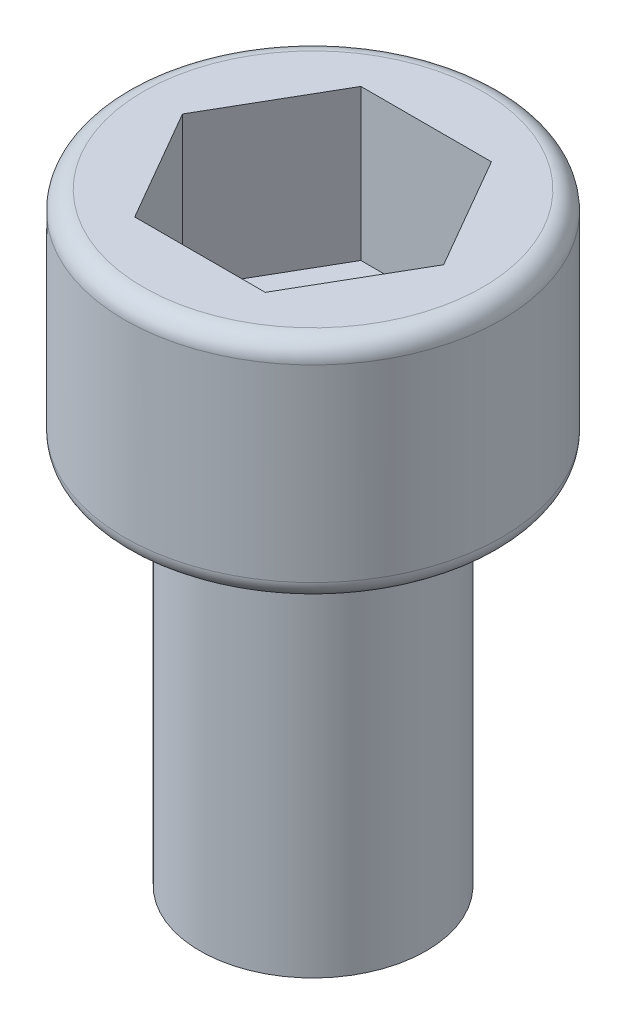
ISO-10303-21;
HEADER;
FILE_DESCRIPTION(('STEP AP214'),'2;1');
FILE_NAME('part.step','',(''),(''),'','','');
FILE_SCHEMA(('AUTOMOTIVE_DESIGN { 1 0 10303 214 1 1 1 1 }'));
ENDSEC;
DATA;
#1=APPLICATION_CONTEXT('core data for automotive mechanical design processes');
#2=APPLICATION_PROTOCOL_DEFINITION('international standard','automotive_design',2000,#1);
#3=PRODUCT_CONTEXT('',#1,'mechanical');
#4=PRODUCT('Part','Part','',(#3));
#5=PRODUCT_RELATED_PRODUCT_CATEGORY('part','',(#4));
#6=PRODUCT_DEFINITION_FORMATION('','',#4);
#7=PRODUCT_DEFINITION_CONTEXT('part definition',#1,'design');
#8=PRODUCT_DEFINITION('design','',#6,#7);
#9=PRODUCT_DEFINITION_SHAPE('','',#8);
#10=(LENGTH_UNIT() NAMED_UNIT(*) SI_UNIT(.MILLI.,.METRE.));
#11=(NAMED_UNIT(*) PLANE_ANGLE_UNIT() SI_UNIT($,.RADIAN.));
#12=(NAMED_UNIT(*) SI_UNIT($,.STERADIAN.) SOLID_ANGLE_UNIT());
#13=UNCERTAINTY_MEASURE_WITH_UNIT(LENGTH_MEASURE(1.E-05),#10,'distance_accuracy_value','');
#14=(GEOMETRIC_REPRESENTATION_CONTEXT(3) GLOBAL_UNCERTAINTY_ASSIGNED_CONTEXT((#13)) GLOBAL_UNIT_ASSIGNED_CONTEXT((#10,
#11,#12)) REPRESENTATION_CONTEXT('',''));
#15=CARTESIAN_POINT('',(0.,0.,0.));
#16=DIRECTION('',(0.,0.,1.));
#17=DIRECTION('',(1.,0.,0.));
#18=AXIS2_PLACEMENT_3D('',#15,#16,#17);
#19=CARTESIAN_POINT('',(0.,-4.,0.));
#20=DIRECTION('',(0.,-1.,0.));
#21=DIRECTION('',(1.,0.,0.));
#22=AXIS2_PLACEMENT_3D('',#19,#20,#21);
#23=PLANE('',#22);
#24=CARTESIAN_POINT('',(0.,-4.,0.));
#25=DIRECTION('',(0.,-1.,0.));
#26=DIRECTION('',(1.,0.,0.));
#27=AXIS2_PLACEMENT_3D('',#24,#25,#26);
#28=CIRCLE('',#27,1.49999999999999);
#29=CARTESIAN_POINT('',(1.5,-4.,0.));
#30=VERTEX_POINT('',#29);
#31=EDGE_CURVE('E171',#30,#30,#28,.T.);
#32=ORIENTED_EDGE('',*,*,#31,.T.);
#33=EDGE_LOOP('',(#32));
#34=FACE_BOUND('',#33,.T.);
#35=ADVANCED_FACE('F43',(#34),#23,.T.);
#36=CARTESIAN_POINT('',(3.42844774755202E-12,-1000.,0.));
#37=DIRECTION('',(0.,-1.,0.));
#38=DIRECTION('',(1.,0.,0.));
#39=AXIS2_PLACEMENT_3D('',#36,#37,#38);
#40=CYLINDRICAL_SURFACE('',#39,1.5);
#41=CARTESIAN_POINT('',(0.,0.99999999999989,0.));
#42=DIRECTION('',(0.,-1.,0.));
#43=DIRECTION('',(1.,0.,0.));
#44=AXIS2_PLACEMENT_3D('',#41,#42,#43);
#45=CIRCLE('',#44,1.50000000000001);
#46=CARTESIAN_POINT('',(1.5,0.999999999999895,0.));
#47=VERTEX_POINT('',#46);
#48=EDGE_CURVE('E158',#47,#47,#45,.T.);
#49=ORIENTED_EDGE('',*,*,#48,.T.);
#50=EDGE_LOOP('',(#49));
#51=FACE_BOUND('',#50,.T.);
#52=ORIENTED_EDGE('',*,*,#31,.F.);
#53=EDGE_LOOP('',(#52));
#54=FACE_BOUND('',#53,.T.);
#55=ADVANCED_FACE('F197',(#51,#54),#40,.T.);
#56=CARTESIAN_POINT('',(1.5,0.999999999999998,0.));
#57=DIRECTION('',(0.,-1.,0.));
#58=DIRECTION('',(1.,0.,0.));
#59=AXIS2_PLACEMENT_3D('',#56,#57,#58);
#60=PLANE('',#59);
#61=CARTESIAN_POINT('',(0.,0.999999999999993,0.));
#62=DIRECTION('',(0.,-1.,0.));
#63=DIRECTION('',(1.,0.,0.));
#64=AXIS2_PLACEMENT_3D('',#61,#62,#63);
#65=CIRCLE('',#64,2.25000000000001);
#66=CARTESIAN_POINT('',(2.25000000000001,1.,0.));
#67=VERTEX_POINT('',#66);
#68=EDGE_CURVE('E175',#67,#67,#65,.T.);
#69=ORIENTED_EDGE('',*,*,#68,.T.);
#70=EDGE_LOOP('',(#69));
#71=FACE_BOUND('',#70,.T.);
#72=ORIENTED_EDGE('',*,*,#48,.F.);
#73=EDGE_LOOP('',(#72));
#74=FACE_BOUND('',#73,.T.);
#75=ADVANCED_FACE('F194',(#71,#74),#60,.T.);
#76=CARTESIAN_POINT('',(3.42844774755202E-12,-1000.,0.));
#77=DIRECTION('',(0.,-1.,0.));
#78=DIRECTION('',(1.,0.,0.));
#79=AXIS2_PLACEMENT_3D('',#76,#77,#78);
#80=CYLINDRICAL_SURFACE('',#79,2.50000000000001);
#81=CARTESIAN_POINT('',(0.,1.24999999999997,0.));
#82=DIRECTION('',(0.,-1.,0.));
#83=DIRECTION('',(1.,0.,0.));
#84=AXIS2_PLACEMENT_3D('',#81,#82,#83);
#85=CIRCLE('',#84,2.50000000000001);
#86=CARTESIAN_POINT('',(2.5,1.24999999999998,0.));
#87=VERTEX_POINT('',#86);
#88=EDGE_CURVE('E52',#87,#87,#85,.F.);
#89=ORIENTED_EDGE('',*,*,#88,.T.);
#90=EDGE_LOOP('',(#89));
#91=FACE_BOUND('',#90,.T.);
#92=CARTESIAN_POINT('',(0.,3.74999999999992,0.));
#93=DIRECTION('',(0.,1.,0.));
#94=DIRECTION('',(-1.,0.,0.));
#95=AXIS2_PLACEMENT_3D('',#92,#93,#94);
#96=CIRCLE('',#95,2.50000000000001);
#97=CARTESIAN_POINT('',(-2.50000000000003,3.74999999999991,0.));
#98=VERTEX_POINT('',#97);
#99=EDGE_CURVE('E179',#98,#98,#96,.F.);
#100=ORIENTED_EDGE('',*,*,#99,.T.);
#101=EDGE_LOOP('',(#100));
#102=FACE_BOUND('',#101,.T.);
#103=ADVANCED_FACE('F186',(#91,#102),#80,.T.);
#104=CARTESIAN_POINT('',(2.5,4.,0.));
#105=DIRECTION('',(0.,1.,0.));
#106=DIRECTION('',(-1.,0.,0.));
#107=AXIS2_PLACEMENT_3D('',#104,#105,#106);
#108=PLANE('',#107);
#109=CARTESIAN_POINT('',(0.,4.,0.));
#110=DIRECTION('',(0.,1.,0.));
#111=DIRECTION('',(-1.,0.,0.));
#112=AXIS2_PLACEMENT_3D('',#109,#110,#111);
#113=CIRCLE('',#112,2.25000000000001);
#114=CARTESIAN_POINT('',(-2.25000000000003,3.99999999999999,0.));
#115=VERTEX_POINT('',#114);
#116=EDGE_CURVE('E11',#115,#115,#113,.T.);
#117=ORIENTED_EDGE('',*,*,#116,.T.);
#118=EDGE_LOOP('',(#117));
#119=FACE_BOUND('',#118,.T.);
#120=DIRECTION('',(-0.5,0.,-0.866025403784438));
#121=VECTOR('',#120,1.);
#122=CARTESIAN_POINT('',(1.73205080756886,4.,0.));
#123=LINE('',#122,#121);
#124=CARTESIAN_POINT('',(1.73205080756886,4.,0.));
#125=VERTEX_POINT('',#124);
#126=CARTESIAN_POINT('',(0.866025403784432,4.,-1.5));
#127=VERTEX_POINT('',#126);
#128=EDGE_CURVE('E59',#125,#127,#123,.T.);
#129=ORIENTED_EDGE('',*,*,#128,.F.);
#130=DIRECTION('',(0.5,0.,-0.866025403784439));
#131=VECTOR('',#130,1.);
#132=CARTESIAN_POINT('',(0.866025403784426,4.,1.5));
#133=LINE('',#132,#131);
#134=CARTESIAN_POINT('',(0.866025403784426,4.,1.5));
#135=VERTEX_POINT('',#134);
#136=EDGE_CURVE('E152',#135,#125,#133,.T.);
#137=ORIENTED_EDGE('',*,*,#136,.F.);
#138=DIRECTION('',(1.,0.,0.));
#139=VECTOR('',#138,1.);
#140=CARTESIAN_POINT('',(-0.866025403784451,3.99999999999999,1.5));
#141=LINE('',#140,#139);
#142=CARTESIAN_POINT('',(-0.866025403784451,3.99999999999999,1.5));
#143=VERTEX_POINT('',#142);
#144=EDGE_CURVE('E149',#143,#135,#141,.T.);
#145=ORIENTED_EDGE('',*,*,#144,.F.);
#146=DIRECTION('',(0.5,0.,0.866025403784438));
#147=VECTOR('',#146,1.);
#148=CARTESIAN_POINT('',(-1.73205080756889,3.99999999999999,0.));
#149=LINE('',#148,#147);
#150=CARTESIAN_POINT('',(-1.73205080756889,3.99999999999999,0.));
#151=VERTEX_POINT('',#150);
#152=EDGE_CURVE('E107',#151,#143,#149,.T.);
#153=ORIENTED_EDGE('',*,*,#152,.F.);
#154=DIRECTION('',(-0.499999999999999,0.,0.866025403784439));
#155=VECTOR('',#154,1.);
#156=CARTESIAN_POINT('',(-0.866025403784453,3.99999999999999,-1.5));
#157=LINE('',#156,#155);
#158=CARTESIAN_POINT('',(-0.866025403784453,3.99999999999999,-1.5));
#159=VERTEX_POINT('',#158);
#160=EDGE_CURVE('E143',#159,#151,#157,.T.);
#161=ORIENTED_EDGE('',*,*,#160,.F.);
#162=DIRECTION('',(-1.,0.,0.));
#163=VECTOR('',#162,1.);
#164=CARTESIAN_POINT('',(0.866025403784425,4.,-1.5));
#165=LINE('',#164,#163);
#166=EDGE_CURVE('E139',#127,#159,#165,.T.);
#167=ORIENTED_EDGE('',*,*,#166,.F.);
#168=EDGE_LOOP('',(#129,#137,#145,#153,#161,#167));
#169=FACE_BOUND('',#168,.T.);
#170=ADVANCED_FACE('F213',(#119,#169),#108,.T.);
#171=CARTESIAN_POINT('',(1.73205080756887,2.,0.));
#172=DIRECTION('',(0.866025403784439,0.,-0.5));
#173=DIRECTION('',(-0.5,0.,-0.866025403784438));
#174=AXIS2_PLACEMENT_3D('',#171,#172,#173);
#175=PLANE('',#174);
#176=ORIENTED_EDGE('',*,*,#128,.T.);
#177=DIRECTION('',(0.,1.,0.));
#178=VECTOR('',#177,1.);
#179=CARTESIAN_POINT('',(0.866025403784432,2.,-1.5));
#180=LINE('',#179,#178);
#181=CARTESIAN_POINT('',(0.866025403784432,2.,-1.5));
#182=VERTEX_POINT('',#181);
#183=EDGE_CURVE('E89',#182,#127,#180,.T.);
#184=ORIENTED_EDGE('',*,*,#183,.F.);
#185=DIRECTION('',(-0.5,0.,-0.866025403784438));
#186=VECTOR('',#185,1.);
#187=CARTESIAN_POINT('',(1.73205080756887,2.,0.));
#188=LINE('',#187,#186);
#189=CARTESIAN_POINT('',(1.73205080756887,2.,0.));
#190=VERTEX_POINT('',#189);
#191=EDGE_CURVE('E155',#190,#182,#188,.T.);
#192=ORIENTED_EDGE('',*,*,#191,.F.);
#193=DIRECTION('',(0.,1.,0.));
#194=VECTOR('',#193,1.);
#195=CARTESIAN_POINT('',(1.73205080756887,2.,0.));
#196=LINE('',#195,#194);
#197=EDGE_CURVE('E67',#190,#125,#196,.T.);
#198=ORIENTED_EDGE('',*,*,#197,.T.);
#199=EDGE_LOOP('',(#176,#184,#192,#198));
#200=FACE_BOUND('',#199,.T.);
#201=ADVANCED_FACE('F216',(#200),#175,.F.);
#202=CARTESIAN_POINT('',(0.866025403784432,2.,1.5));
#203=DIRECTION('',(0.866025403784439,0.,0.5));
#204=DIRECTION('',(0.5,0.,-0.866025403784439));
#205=AXIS2_PLACEMENT_3D('',#202,#203,#204);
#206=PLANE('',#205);
#207=ORIENTED_EDGE('',*,*,#136,.T.);
#208=ORIENTED_EDGE('',*,*,#197,.F.);
#209=DIRECTION('',(0.5,0.,-0.866025403784439));
#210=VECTOR('',#209,1.);
#211=CARTESIAN_POINT('',(0.866025403784432,2.,1.5));
#212=LINE('',#211,#210);
#213=CARTESIAN_POINT('',(0.866025403784432,2.,1.5));
#214=VERTEX_POINT('',#213);
#215=EDGE_CURVE('E121',#214,#190,#212,.T.);
#216=ORIENTED_EDGE('',*,*,#215,.F.);
#217=DIRECTION('',(0.,1.,0.));
#218=VECTOR('',#217,1.);
#219=CARTESIAN_POINT('',(0.866025403784432,2.,1.5));
#220=LINE('',#219,#218);
#221=EDGE_CURVE('E112',#214,#135,#220,.T.);
#222=ORIENTED_EDGE('',*,*,#221,.T.);
#223=EDGE_LOOP('',(#207,#208,#216,#222));
#224=FACE_BOUND('',#223,.T.);
#225=ADVANCED_FACE('F220',(#224),#206,.F.);
#226=CARTESIAN_POINT('',(-0.866025403784444,1.99999999999999,1.5));
#227=DIRECTION('',(0.,0.,1.));
#228=DIRECTION('',(1.,0.,0.));
#229=AXIS2_PLACEMENT_3D('',#226,#227,#228);
#230=PLANE('',#229);
#231=ORIENTED_EDGE('',*,*,#144,.T.);
#232=ORIENTED_EDGE('',*,*,#221,.F.);
#233=DIRECTION('',(1.,0.,0.));
#234=VECTOR('',#233,1.);
#235=CARTESIAN_POINT('',(-0.866025403784444,1.99999999999999,1.5));
#236=LINE('',#235,#234);
#237=CARTESIAN_POINT('',(-0.866025403784444,1.99999999999999,1.5));
#238=VERTEX_POINT('',#237);
#239=EDGE_CURVE('E116',#238,#214,#236,.T.);
#240=ORIENTED_EDGE('',*,*,#239,.F.);
#241=DIRECTION('',(0.,1.,0.));
#242=VECTOR('',#241,1.);
#243=CARTESIAN_POINT('',(-0.866025403784444,1.99999999999999,1.5));
#244=LINE('',#243,#242);
#245=EDGE_CURVE('E100',#238,#143,#244,.T.);
#246=ORIENTED_EDGE('',*,*,#245,.T.);
#247=EDGE_LOOP('',(#231,#232,#240,#246));
#248=FACE_BOUND('',#247,.T.);
#249=ADVANCED_FACE('F117',(#248),#230,.F.);
#250=CARTESIAN_POINT('',(-1.73205080756888,1.99999999999999,0.));
#251=DIRECTION('',(-0.866025403784438,0.,0.5));
#252=DIRECTION('',(0.5,0.,0.866025403784438));
#253=AXIS2_PLACEMENT_3D('',#250,#251,#252);
#254=PLANE('',#253);
#255=ORIENTED_EDGE('',*,*,#152,.T.);
#256=ORIENTED_EDGE('',*,*,#245,.F.);
#257=DIRECTION('',(0.5,0.,0.866025403784438));
#258=VECTOR('',#257,1.);
#259=CARTESIAN_POINT('',(-1.73205080756888,1.99999999999999,0.));
#260=LINE('',#259,#258);
#261=CARTESIAN_POINT('',(-1.73205080756888,1.99999999999999,0.));
#262=VERTEX_POINT('',#261);
#263=EDGE_CURVE('E104',#262,#238,#260,.T.);
#264=ORIENTED_EDGE('',*,*,#263,.F.);
#265=DIRECTION('',(0.,1.,0.));
#266=VECTOR('',#265,1.);
#267=CARTESIAN_POINT('',(-1.73205080756888,1.99999999999999,0.));
#268=LINE('',#267,#266);
#269=EDGE_CURVE('E113',#262,#151,#268,.T.);
#270=ORIENTED_EDGE('',*,*,#269,.T.);
#271=EDGE_LOOP('',(#255,#256,#264,#270));
#272=FACE_BOUND('',#271,.T.);
#273=ADVANCED_FACE('F102',(#272),#254,.F.);
#274=CARTESIAN_POINT('',(-0.866025403784446,1.99999999999999,-1.5));
#275=DIRECTION('',(-0.866025403784439,0.,-0.499999999999999));
#276=DIRECTION('',(-0.5,0.,0.866025403784439));
#277=AXIS2_PLACEMENT_3D('',#274,#275,#276);
#278=PLANE('',#277);
#279=ORIENTED_EDGE('',*,*,#160,.T.);
#280=ORIENTED_EDGE('',*,*,#269,.F.);
#281=DIRECTION('',(-0.499999999999999,0.,0.866025403784439));
#282=VECTOR('',#281,1.);
#283=CARTESIAN_POINT('',(-0.866025403784446,1.99999999999999,-1.5));
#284=LINE('',#283,#282);
#285=CARTESIAN_POINT('',(-0.866025403784446,1.99999999999999,-1.5));
#286=VERTEX_POINT('',#285);
#287=EDGE_CURVE('E127',#286,#262,#284,.T.);
#288=ORIENTED_EDGE('',*,*,#287,.F.);
#289=DIRECTION('',(0.,1.,0.));
#290=VECTOR('',#289,1.);
#291=CARTESIAN_POINT('',(-0.866025403784446,1.99999999999999,-1.5));
#292=LINE('',#291,#290);
#293=EDGE_CURVE('E163',#286,#159,#292,.T.);
#294=ORIENTED_EDGE('',*,*,#293,.T.);
#295=EDGE_LOOP('',(#279,#280,#288,#294));
#296=FACE_BOUND('',#295,.T.);
#297=ADVANCED_FACE('F224',(#296),#278,.F.);
#298=CARTESIAN_POINT('',(0.866025403784432,2.,-1.5));
#299=DIRECTION('',(0.,0.,-1.));
#300=DIRECTION('',(-1.,0.,0.));
#301=AXIS2_PLACEMENT_3D('',#298,#299,#300);
#302=PLANE('',#301);
#303=ORIENTED_EDGE('',*,*,#166,.T.);
#304=ORIENTED_EDGE('',*,*,#293,.F.);
#305=DIRECTION('',(-1.,0.,0.));
#306=VECTOR('',#305,1.);
#307=CARTESIAN_POINT('',(0.866025403784432,2.,-1.5));
#308=LINE('',#307,#306);
#309=EDGE_CURVE('E131',#182,#286,#308,.T.);
#310=ORIENTED_EDGE('',*,*,#309,.F.);
#311=ORIENTED_EDGE('',*,*,#183,.T.);
#312=EDGE_LOOP('',(#303,#304,#310,#311));
#313=FACE_BOUND('',#312,.T.);
#314=ADVANCED_FACE('F221',(#313),#302,.F.);
#315=CARTESIAN_POINT('',(0.,2.,0.));
#316=DIRECTION('',(0.,1.,0.));
#317=DIRECTION('',(-1.,0.,0.));
#318=AXIS2_PLACEMENT_3D('',#315,#316,#317);
#319=PLANE('',#318);
#320=ORIENTED_EDGE('',*,*,#191,.T.);
#321=ORIENTED_EDGE('',*,*,#309,.T.);
#322=ORIENTED_EDGE('',*,*,#287,.T.);
#323=ORIENTED_EDGE('',*,*,#263,.T.);
#324=ORIENTED_EDGE('',*,*,#239,.T.);
#325=ORIENTED_EDGE('',*,*,#215,.T.);
#326=EDGE_LOOP('',(#320,#321,#322,#323,#324,#325));
#327=FACE_BOUND('',#326,.T.);
#328=ADVANCED_FACE('F124',(#327),#319,.T.);
#329=CARTESIAN_POINT('',(0.,1.24999999999997,0.));
#330=DIRECTION('',(0.,-1.,0.));
#331=DIRECTION('',(1.,0.,0.));
#332=AXIS2_PLACEMENT_3D('',#329,#330,#331);
#333=TOROIDAL_SURFACE('',#332,2.25000000000001,0.25);
#334=ORIENTED_EDGE('',*,*,#88,.F.);
#335=EDGE_LOOP('',(#334));
#336=FACE_BOUND('',#335,.T.);
#337=ORIENTED_EDGE('',*,*,#68,.F.);
#338=EDGE_LOOP('',(#337));
#339=FACE_BOUND('',#338,.T.);
#340=ADVANCED_FACE('F189',(#336,#339),#333,.T.);
#341=CARTESIAN_POINT('',(0.,3.74999999999992,0.));
#342=DIRECTION('',(0.,1.,0.));
#343=DIRECTION('',(-1.,0.,0.));
#344=AXIS2_PLACEMENT_3D('',#341,#342,#343);
#345=TOROIDAL_SURFACE('',#344,2.25000000000001,0.25);
#346=ORIENTED_EDGE('',*,*,#116,.F.);
#347=EDGE_LOOP('',(#346));
#348=FACE_BOUND('',#347,.T.);
#349=ORIENTED_EDGE('',*,*,#99,.F.);
#350=EDGE_LOOP('',(#349));
#351=FACE_BOUND('',#350,.T.);
#352=ADVANCED_FACE('F45',(#348,#351),#345,.T.);
#353=CLOSED_SHELL('',(#35,#55,#75,#103,#170,#201,#225,#249,#273,#297,#314,#328,#340,#352));
#354=MANIFOLD_SOLID_BREP('B2',#353);
#355=ADVANCED_BREP_SHAPE_REPRESENTATION('',(#18,#354),#14);
#356=SHAPE_DEFINITION_REPRESENTATION(#9,#355);
ENDSEC;
END-ISO-10303-21;
